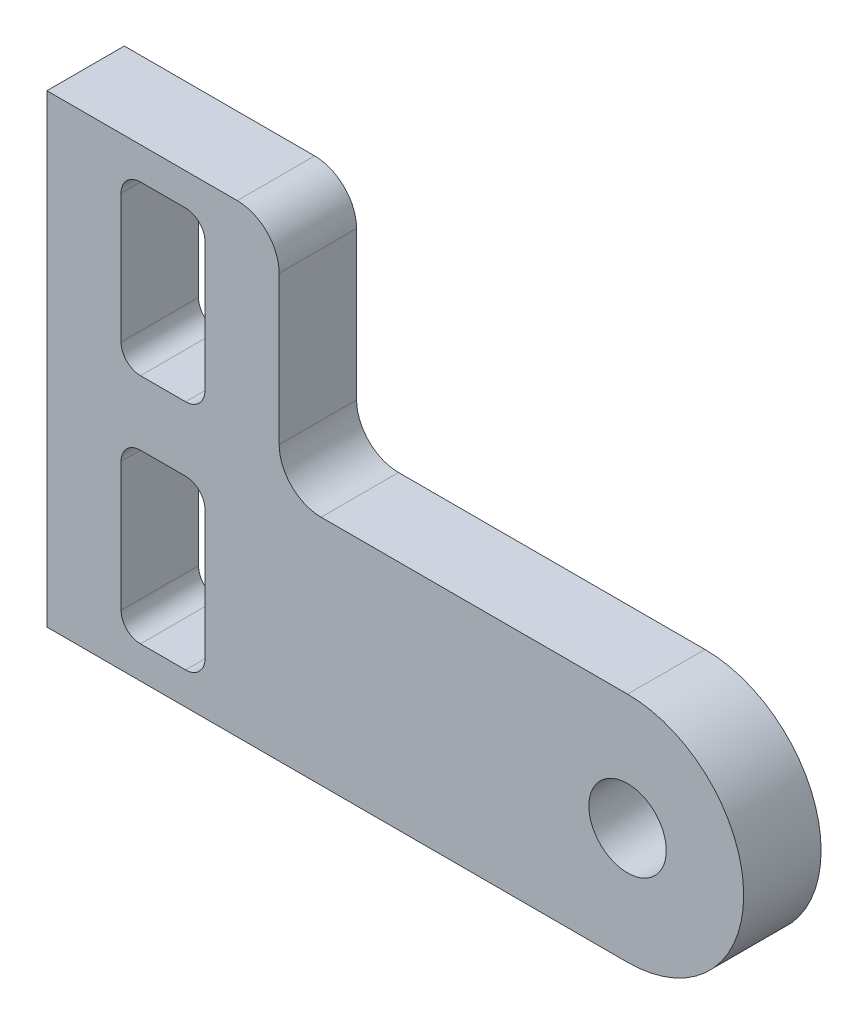
ISO-10303-21;
HEADER;
FILE_DESCRIPTION(('STEP AP214'),'2;1');
FILE_NAME('part.step','',(''),(''),'','','');
FILE_SCHEMA(('AUTOMOTIVE_DESIGN { 1 0 10303 214 1 1 1 1 }'));
ENDSEC;
DATA;
#1=APPLICATION_CONTEXT('core data for automotive mechanical design processes');
#2=APPLICATION_PROTOCOL_DEFINITION('international standard','automotive_design',2000,#1);
#3=PRODUCT_CONTEXT('',#1,'mechanical');
#4=PRODUCT('Part','Part','',(#3));
#5=PRODUCT_RELATED_PRODUCT_CATEGORY('part','',(#4));
#6=PRODUCT_DEFINITION_FORMATION('','',#4);
#7=PRODUCT_DEFINITION_CONTEXT('part definition',#1,'design');
#8=PRODUCT_DEFINITION('design','',#6,#7);
#9=PRODUCT_DEFINITION_SHAPE('','',#8);
#10=(LENGTH_UNIT() NAMED_UNIT(*) SI_UNIT(.MILLI.,.METRE.));
#11=(NAMED_UNIT(*) PLANE_ANGLE_UNIT() SI_UNIT($,.RADIAN.));
#12=(NAMED_UNIT(*) SI_UNIT($,.STERADIAN.) SOLID_ANGLE_UNIT());
#13=UNCERTAINTY_MEASURE_WITH_UNIT(LENGTH_MEASURE(1.E-05),#10,'distance_accuracy_value','');
#14=(GEOMETRIC_REPRESENTATION_CONTEXT(3) GLOBAL_UNCERTAINTY_ASSIGNED_CONTEXT((#13)) GLOBAL_UNIT_ASSIGNED_CONTEXT((#10,
#11,#12)) REPRESENTATION_CONTEXT('',''));
#15=CARTESIAN_POINT('',(0.,0.,0.));
#16=DIRECTION('',(0.,0.,1.));
#17=DIRECTION('',(1.,0.,0.));
#18=AXIS2_PLACEMENT_3D('',#15,#16,#17);
#19=CARTESIAN_POINT('',(201.0978533093,269.1465473352,3.));
#20=DIRECTION('',(0.,0.,1.));
#21=DIRECTION('',(1.,0.,0.));
#22=AXIS2_PLACEMENT_3D('',#19,#20,#21);
#23=PLANE('',#22);
#24=DIRECTION('',(1.,0.,0.));
#25=VECTOR('',#24,1.);
#26=CARTESIAN_POINT('',(182.2228533093,265.8965473352,3.));
#27=LINE('',#26,#25);
#28=CARTESIAN_POINT('',(182.2228533093,265.8965473352,3.));
#29=VERTEX_POINT('',#28);
#30=CARTESIAN_POINT('',(183.9728533093,265.8965473352,3.));
#31=VERTEX_POINT('',#30);
#32=EDGE_CURVE('E261',#29,#31,#27,.T.);
#33=ORIENTED_EDGE('',*,*,#32,.F.);
#34=CARTESIAN_POINT('',(182.2228533093,266.6465473352,3.));
#35=DIRECTION('',(0.,0.,1.));
#36=DIRECTION('',(1.,0.,0.));
#37=AXIS2_PLACEMENT_3D('',#34,#35,#36);
#38=CIRCLE('',#37,0.749999999999987);
#39=CARTESIAN_POINT('',(181.4728533093,266.6465473352,3.));
#40=VERTEX_POINT('',#39);
#41=EDGE_CURVE('E259',#40,#29,#38,.T.);
#42=ORIENTED_EDGE('',*,*,#41,.F.);
#43=DIRECTION('',(0.,-1.,0.));
#44=VECTOR('',#43,1.);
#45=CARTESIAN_POINT('',(181.4728533093,271.6465473352,3.));
#46=LINE('',#45,#44);
#47=CARTESIAN_POINT('',(181.4728533093,271.6465473352,3.));
#48=VERTEX_POINT('',#47);
#49=EDGE_CURVE('E275',#48,#40,#46,.T.);
#50=ORIENTED_EDGE('',*,*,#49,.F.);
#51=CARTESIAN_POINT('',(182.2228533093,271.6465473352,3.));
#52=DIRECTION('',(0.,0.,1.));
#53=DIRECTION('',(1.,0.,0.));
#54=AXIS2_PLACEMENT_3D('',#51,#52,#53);
#55=CIRCLE('',#54,0.750000000000015);
#56=CARTESIAN_POINT('',(182.2228533093,272.3965473352,3.));
#57=VERTEX_POINT('',#56);
#58=EDGE_CURVE('E272',#57,#48,#55,.T.);
#59=ORIENTED_EDGE('',*,*,#58,.F.);
#60=DIRECTION('',(-1.,0.,0.));
#61=VECTOR('',#60,1.);
#62=CARTESIAN_POINT('',(183.9728533093,272.3965473352,3.));
#63=LINE('',#62,#61);
#64=CARTESIAN_POINT('',(183.9728533093,272.3965473352,3.));
#65=VERTEX_POINT('',#64);
#66=EDGE_CURVE('E270',#65,#57,#63,.T.);
#67=ORIENTED_EDGE('',*,*,#66,.F.);
#68=CARTESIAN_POINT('',(183.9728533093,271.6465473352,3.));
#69=DIRECTION('',(0.,0.,1.));
#70=DIRECTION('',(1.,0.,0.));
#71=AXIS2_PLACEMENT_3D('',#68,#69,#70);
#72=CIRCLE('',#71,0.750000000000015);
#73=CARTESIAN_POINT('',(184.7228533093,271.6465473352,3.));
#74=VERTEX_POINT('',#73);
#75=EDGE_CURVE('E268',#74,#65,#72,.T.);
#76=ORIENTED_EDGE('',*,*,#75,.F.);
#77=DIRECTION('',(0.,1.,0.));
#78=VECTOR('',#77,1.);
#79=CARTESIAN_POINT('',(184.7228533093,266.6465473352,3.));
#80=LINE('',#79,#78);
#81=CARTESIAN_POINT('',(184.7228533093,266.6465473352,3.));
#82=VERTEX_POINT('',#81);
#83=EDGE_CURVE('E266',#82,#74,#80,.T.);
#84=ORIENTED_EDGE('',*,*,#83,.F.);
#85=CARTESIAN_POINT('',(183.9728533093,266.6465473352,3.));
#86=DIRECTION('',(0.,0.,1.));
#87=DIRECTION('',(1.,0.,0.));
#88=AXIS2_PLACEMENT_3D('',#85,#86,#87);
#89=CIRCLE('',#88,0.749999999999987);
#90=EDGE_CURVE('E264',#31,#82,#89,.T.);
#91=ORIENTED_EDGE('',*,*,#90,.F.);
#92=EDGE_LOOP('',(#33,#42,#50,#59,#67,#76,#84,#91));
#93=FACE_BOUND('',#92,.T.);
#94=CARTESIAN_POINT('',(201.0978533093,269.1465473352,3.));
#95=DIRECTION('',(0.,0.,1.));
#96=DIRECTION('',(1.,0.,0.));
#97=AXIS2_PLACEMENT_3D('',#94,#95,#96);
#98=CIRCLE('',#97,4.49999999999998);
#99=CARTESIAN_POINT('',(201.0978533093,264.6465473352,3.));
#100=VERTEX_POINT('',#99);
#101=CARTESIAN_POINT('',(201.0978533093,273.6465473352,3.));
#102=VERTEX_POINT('',#101);
#103=EDGE_CURVE('E324',#100,#102,#98,.T.);
#104=ORIENTED_EDGE('',*,*,#103,.T.);
#105=DIRECTION('',(-1.,0.,0.));
#106=VECTOR('',#105,1.);
#107=CARTESIAN_POINT('',(189.2228533093,273.6465473352,3.));
#108=LINE('',#107,#106);
#109=CARTESIAN_POINT('',(189.2228533093,273.6465473352,3.));
#110=VERTEX_POINT('',#109);
#111=EDGE_CURVE('E327',#102,#110,#108,.T.);
#112=ORIENTED_EDGE('',*,*,#111,.T.);
#113=CARTESIAN_POINT('',(189.2228533093,275.2715473352,3.));
#114=DIRECTION('',(0.,0.,-1.));
#115=DIRECTION('',(1.,0.,0.));
#116=AXIS2_PLACEMENT_3D('',#113,#114,#115);
#117=CIRCLE('',#116,1.62500000000002);
#118=CARTESIAN_POINT('',(187.5978533093,275.2715473352,3.));
#119=VERTEX_POINT('',#118);
#120=EDGE_CURVE('E330',#110,#119,#117,.T.);
#121=ORIENTED_EDGE('',*,*,#120,.T.);
#122=DIRECTION('',(0.,1.,0.));
#123=VECTOR('',#122,1.);
#124=CARTESIAN_POINT('',(187.5978533093,281.0215473352,3.));
#125=LINE('',#124,#123);
#126=CARTESIAN_POINT('',(187.5978533093,281.0215473352,3.));
#127=VERTEX_POINT('',#126);
#128=EDGE_CURVE('E332',#119,#127,#125,.T.);
#129=ORIENTED_EDGE('',*,*,#128,.T.);
#130=CARTESIAN_POINT('',(185.9728533093,281.0215473352,3.));
#131=DIRECTION('',(0.,0.,1.));
#132=DIRECTION('',(1.,0.,0.));
#133=AXIS2_PLACEMENT_3D('',#130,#131,#132);
#134=CIRCLE('',#133,1.62499999999999);
#135=CARTESIAN_POINT('',(185.9728533093,282.6465473352,3.));
#136=VERTEX_POINT('',#135);
#137=EDGE_CURVE('E334',#127,#136,#134,.T.);
#138=ORIENTED_EDGE('',*,*,#137,.T.);
#139=DIRECTION('',(-1.,0.,0.));
#140=VECTOR('',#139,1.);
#141=CARTESIAN_POINT('',(185.9728533093,282.6465473352,3.));
#142=LINE('',#141,#140);
#143=CARTESIAN_POINT('',(178.5978533093,282.6465473352,3.));
#144=VERTEX_POINT('',#143);
#145=EDGE_CURVE('E336',#136,#144,#142,.T.);
#146=ORIENTED_EDGE('',*,*,#145,.T.);
#147=DIRECTION('',(0.,-1.,0.));
#148=VECTOR('',#147,1.);
#149=CARTESIAN_POINT('',(178.5978533093,282.6465473352,3.));
#150=LINE('',#149,#148);
#151=CARTESIAN_POINT('',(178.5978533093,264.6465473352,3.));
#152=VERTEX_POINT('',#151);
#153=EDGE_CURVE('E338',#144,#152,#150,.T.);
#154=ORIENTED_EDGE('',*,*,#153,.T.);
#155=DIRECTION('',(1.,0.,0.));
#156=VECTOR('',#155,1.);
#157=CARTESIAN_POINT('',(201.0978533093,264.6465473352,3.));
#158=LINE('',#157,#156);
#159=EDGE_CURVE('E340',#152,#100,#158,.T.);
#160=ORIENTED_EDGE('',*,*,#159,.T.);
#161=EDGE_LOOP('',(#104,#112,#121,#129,#138,#146,#154,#160));
#162=FACE_BOUND('',#161,.T.);
#163=CARTESIAN_POINT('',(201.0978533093,269.1465473352,3.));
#164=DIRECTION('',(0.,0.,1.));
#165=DIRECTION('',(1.,0.,0.));
#166=AXIS2_PLACEMENT_3D('',#163,#164,#165);
#167=CIRCLE('',#166,1.5);
#168=CARTESIAN_POINT('',(202.5978533093,269.1465473352,3.));
#169=VERTEX_POINT('',#168);
#170=EDGE_CURVE('E318',#169,#169,#167,.T.);
#171=ORIENTED_EDGE('',*,*,#170,.F.);
#172=EDGE_LOOP('',(#171));
#173=FACE_BOUND('',#172,.T.);
#174=DIRECTION('',(1.,0.,0.));
#175=VECTOR('',#174,1.);
#176=CARTESIAN_POINT('',(182.2228533093,274.8959687639,3.));
#177=LINE('',#176,#175);
#178=CARTESIAN_POINT('',(182.2228533093,274.8959687639,3.));
#179=VERTEX_POINT('',#178);
#180=CARTESIAN_POINT('',(183.9728533093,274.8959687639,3.));
#181=VERTEX_POINT('',#180);
#182=EDGE_CURVE('E202',#179,#181,#177,.T.);
#183=ORIENTED_EDGE('',*,*,#182,.F.);
#184=CARTESIAN_POINT('',(182.2228533093,275.6459687639,3.));
#185=DIRECTION('',(0.,0.,1.));
#186=DIRECTION('',(1.,0.,0.));
#187=AXIS2_PLACEMENT_3D('',#184,#185,#186);
#188=CIRCLE('',#187,0.750000000000015);
#189=CARTESIAN_POINT('',(181.4728533093,275.6459687639,3.));
#190=VERTEX_POINT('',#189);
#191=EDGE_CURVE('E194',#190,#179,#188,.T.);
#192=ORIENTED_EDGE('',*,*,#191,.F.);
#193=DIRECTION('',(0.,-1.,0.));
#194=VECTOR('',#193,1.);
#195=CARTESIAN_POINT('',(181.4728533093,280.6459687639,3.));
#196=LINE('',#195,#194);
#197=CARTESIAN_POINT('',(181.4728533093,280.6459687639,3.));
#198=VERTEX_POINT('',#197);
#199=EDGE_CURVE('E227',#198,#190,#196,.T.);
#200=ORIENTED_EDGE('',*,*,#199,.F.);
#201=CARTESIAN_POINT('',(182.2228533093,280.6459687639,3.));
#202=DIRECTION('',(0.,0.,1.));
#203=DIRECTION('',(1.,0.,0.));
#204=AXIS2_PLACEMENT_3D('',#201,#202,#203);
#205=CIRCLE('',#204,0.750000000000015);
#206=CARTESIAN_POINT('',(182.2228533093,281.3959687639,3.));
#207=VERTEX_POINT('',#206);
#208=EDGE_CURVE('E225',#207,#198,#205,.T.);
#209=ORIENTED_EDGE('',*,*,#208,.F.);
#210=DIRECTION('',(-1.,0.,0.));
#211=VECTOR('',#210,1.);
#212=CARTESIAN_POINT('',(183.9728533093,281.3959687639,3.));
#213=LINE('',#212,#211);
#214=CARTESIAN_POINT('',(183.9728533093,281.3959687639,3.));
#215=VERTEX_POINT('',#214);
#216=EDGE_CURVE('E223',#215,#207,#213,.T.);
#217=ORIENTED_EDGE('',*,*,#216,.F.);
#218=CARTESIAN_POINT('',(183.9728533093,280.6459687639,3.));
#219=DIRECTION('',(0.,0.,1.));
#220=DIRECTION('',(1.,0.,0.));
#221=AXIS2_PLACEMENT_3D('',#218,#219,#220);
#222=CIRCLE('',#221,0.750000000000015);
#223=CARTESIAN_POINT('',(184.7228533093,280.6459687639,3.));
#224=VERTEX_POINT('',#223);
#225=EDGE_CURVE('E221',#224,#215,#222,.T.);
#226=ORIENTED_EDGE('',*,*,#225,.F.);
#227=DIRECTION('',(0.,1.,0.));
#228=VECTOR('',#227,1.);
#229=CARTESIAN_POINT('',(184.7228533093,275.6459687639,3.));
#230=LINE('',#229,#228);
#231=CARTESIAN_POINT('',(184.7228533093,275.6459687639,3.));
#232=VERTEX_POINT('',#231);
#233=EDGE_CURVE('E217',#232,#224,#230,.T.);
#234=ORIENTED_EDGE('',*,*,#233,.F.);
#235=CARTESIAN_POINT('',(183.9728533093,275.6459687639,3.));
#236=DIRECTION('',(0.,0.,1.));
#237=DIRECTION('',(1.,0.,0.));
#238=AXIS2_PLACEMENT_3D('',#235,#236,#237);
#239=CIRCLE('',#238,0.750000000000015);
#240=EDGE_CURVE('E215',#181,#232,#239,.T.);
#241=ORIENTED_EDGE('',*,*,#240,.F.);
#242=EDGE_LOOP('',(#183,#192,#200,#209,#217,#226,#234,#241));
#243=FACE_BOUND('',#242,.T.);
#244=ADVANCED_FACE('F33',(#93,#162,#173,#243),#23,.T.);
#245=CARTESIAN_POINT('',(201.0978533093,269.1465473352,0.));
#246=DIRECTION('',(0.,0.,1.));
#247=DIRECTION('',(1.,0.,0.));
#248=AXIS2_PLACEMENT_3D('',#245,#246,#247);
#249=PLANE('',#248);
#250=CARTESIAN_POINT('',(182.2228533093,266.6465473352,0.));
#251=DIRECTION('',(0.,0.,1.));
#252=DIRECTION('',(1.,0.,0.));
#253=AXIS2_PLACEMENT_3D('',#250,#251,#252);
#254=CIRCLE('',#253,0.749999999999987);
#255=CARTESIAN_POINT('',(181.4728533093,266.6465473352,0.));
#256=VERTEX_POINT('',#255);
#257=CARTESIAN_POINT('',(182.2228533093,265.8965473352,0.));
#258=VERTEX_POINT('',#257);
#259=EDGE_CURVE('E210',#256,#258,#254,.T.);
#260=ORIENTED_EDGE('',*,*,#259,.T.);
#261=DIRECTION('',(1.,0.,0.));
#262=VECTOR('',#261,1.);
#263=CARTESIAN_POINT('',(182.2228533093,265.8965473352,0.));
#264=LINE('',#263,#262);
#265=CARTESIAN_POINT('',(183.9728533093,265.8965473352,0.));
#266=VERTEX_POINT('',#265);
#267=EDGE_CURVE('E280',#258,#266,#264,.T.);
#268=ORIENTED_EDGE('',*,*,#267,.T.);
#269=CARTESIAN_POINT('',(183.9728533093,266.6465473352,0.));
#270=DIRECTION('',(0.,0.,1.));
#271=DIRECTION('',(1.,0.,0.));
#272=AXIS2_PLACEMENT_3D('',#269,#270,#271);
#273=CIRCLE('',#272,0.749999999999987);
#274=CARTESIAN_POINT('',(184.7228533093,266.6465473352,0.));
#275=VERTEX_POINT('',#274);
#276=EDGE_CURVE('E283',#266,#275,#273,.T.);
#277=ORIENTED_EDGE('',*,*,#276,.T.);
#278=DIRECTION('',(0.,1.,0.));
#279=VECTOR('',#278,1.);
#280=CARTESIAN_POINT('',(184.7228533093,266.6465473352,0.));
#281=LINE('',#280,#279);
#282=CARTESIAN_POINT('',(184.7228533093,271.6465473352,0.));
#283=VERTEX_POINT('',#282);
#284=EDGE_CURVE('E286',#275,#283,#281,.T.);
#285=ORIENTED_EDGE('',*,*,#284,.T.);
#286=CARTESIAN_POINT('',(183.9728533093,271.6465473352,0.));
#287=DIRECTION('',(0.,0.,1.));
#288=DIRECTION('',(1.,0.,0.));
#289=AXIS2_PLACEMENT_3D('',#286,#287,#288);
#290=CIRCLE('',#289,0.750000000000015);
#291=CARTESIAN_POINT('',(183.9728533093,272.3965473352,0.));
#292=VERTEX_POINT('',#291);
#293=EDGE_CURVE('E289',#283,#292,#290,.T.);
#294=ORIENTED_EDGE('',*,*,#293,.T.);
#295=DIRECTION('',(-1.,0.,0.));
#296=VECTOR('',#295,1.);
#297=CARTESIAN_POINT('',(183.9728533093,272.3965473352,0.));
#298=LINE('',#297,#296);
#299=CARTESIAN_POINT('',(182.2228533093,272.3965473352,0.));
#300=VERTEX_POINT('',#299);
#301=EDGE_CURVE('E292',#292,#300,#298,.T.);
#302=ORIENTED_EDGE('',*,*,#301,.T.);
#303=CARTESIAN_POINT('',(182.2228533093,271.6465473352,0.));
#304=DIRECTION('',(0.,0.,1.));
#305=DIRECTION('',(1.,0.,0.));
#306=AXIS2_PLACEMENT_3D('',#303,#304,#305);
#307=CIRCLE('',#306,0.750000000000015);
#308=CARTESIAN_POINT('',(181.4728533093,271.6465473352,0.));
#309=VERTEX_POINT('',#308);
#310=EDGE_CURVE('E295',#300,#309,#307,.T.);
#311=ORIENTED_EDGE('',*,*,#310,.T.);
#312=DIRECTION('',(0.,-1.,0.));
#313=VECTOR('',#312,1.);
#314=CARTESIAN_POINT('',(181.4728533093,271.6465473352,0.));
#315=LINE('',#314,#313);
#316=EDGE_CURVE('E262',#309,#256,#315,.T.);
#317=ORIENTED_EDGE('',*,*,#316,.T.);
#318=EDGE_LOOP('',(#260,#268,#277,#285,#294,#302,#311,#317));
#319=FACE_BOUND('',#318,.T.);
#320=CARTESIAN_POINT('',(201.0978533093,269.1465473352,0.));
#321=DIRECTION('',(0.,0.,1.));
#322=DIRECTION('',(1.,0.,0.));
#323=AXIS2_PLACEMENT_3D('',#320,#321,#322);
#324=CIRCLE('',#323,4.49999999999998);
#325=CARTESIAN_POINT('',(201.0978533093,264.6465473352,0.));
#326=VERTEX_POINT('',#325);
#327=CARTESIAN_POINT('',(201.0978533093,273.6465473352,0.));
#328=VERTEX_POINT('',#327);
#329=EDGE_CURVE('E321',#326,#328,#324,.T.);
#330=ORIENTED_EDGE('',*,*,#329,.F.);
#331=DIRECTION('',(1.,0.,0.));
#332=VECTOR('',#331,1.);
#333=CARTESIAN_POINT('',(201.0978533093,264.6465473352,0.));
#334=LINE('',#333,#332);
#335=CARTESIAN_POINT('',(178.5978533093,264.6465473352,0.));
#336=VERTEX_POINT('',#335);
#337=EDGE_CURVE('E328',#336,#326,#334,.T.);
#338=ORIENTED_EDGE('',*,*,#337,.F.);
#339=DIRECTION('',(0.,-1.,0.));
#340=VECTOR('',#339,1.);
#341=CARTESIAN_POINT('',(178.5978533093,282.6465473352,0.));
#342=LINE('',#341,#340);
#343=CARTESIAN_POINT('',(178.5978533093,282.6465473352,0.));
#344=VERTEX_POINT('',#343);
#345=EDGE_CURVE('E355',#344,#336,#342,.T.);
#346=ORIENTED_EDGE('',*,*,#345,.F.);
#347=DIRECTION('',(-1.,0.,0.));
#348=VECTOR('',#347,1.);
#349=CARTESIAN_POINT('',(185.9728533093,282.6465473352,0.));
#350=LINE('',#349,#348);
#351=CARTESIAN_POINT('',(185.9728533093,282.6465473352,0.));
#352=VERTEX_POINT('',#351);
#353=EDGE_CURVE('E353',#352,#344,#350,.T.);
#354=ORIENTED_EDGE('',*,*,#353,.F.);
#355=CARTESIAN_POINT('',(185.9728533093,281.0215473352,0.));
#356=DIRECTION('',(0.,0.,1.));
#357=DIRECTION('',(1.,0.,0.));
#358=AXIS2_PLACEMENT_3D('',#355,#356,#357);
#359=CIRCLE('',#358,1.62499999999999);
#360=CARTESIAN_POINT('',(187.5978533093,281.0215473352,0.));
#361=VERTEX_POINT('',#360);
#362=EDGE_CURVE('E351',#361,#352,#359,.T.);
#363=ORIENTED_EDGE('',*,*,#362,.F.);
#364=DIRECTION('',(0.,1.,0.));
#365=VECTOR('',#364,1.);
#366=CARTESIAN_POINT('',(187.5978533093,281.0215473352,0.));
#367=LINE('',#366,#365);
#368=CARTESIAN_POINT('',(187.5978533093,275.2715473352,0.));
#369=VERTEX_POINT('',#368);
#370=EDGE_CURVE('E349',#369,#361,#367,.T.);
#371=ORIENTED_EDGE('',*,*,#370,.F.);
#372=CARTESIAN_POINT('',(189.2228533093,275.2715473352,0.));
#373=DIRECTION('',(0.,0.,-1.));
#374=DIRECTION('',(1.,0.,0.));
#375=AXIS2_PLACEMENT_3D('',#372,#373,#374);
#376=CIRCLE('',#375,1.62500000000002);
#377=CARTESIAN_POINT('',(189.2228533093,273.6465473352,0.));
#378=VERTEX_POINT('',#377);
#379=EDGE_CURVE('E347',#378,#369,#376,.T.);
#380=ORIENTED_EDGE('',*,*,#379,.F.);
#381=DIRECTION('',(-1.,0.,0.));
#382=VECTOR('',#381,1.);
#383=CARTESIAN_POINT('',(189.2228533093,273.6465473352,0.));
#384=LINE('',#383,#382);
#385=EDGE_CURVE('E345',#328,#378,#384,.T.);
#386=ORIENTED_EDGE('',*,*,#385,.F.);
#387=EDGE_LOOP('',(#330,#338,#346,#354,#363,#371,#380,#386));
#388=FACE_BOUND('',#387,.T.);
#389=CARTESIAN_POINT('',(201.0978533093,269.1465473352,0.));
#390=DIRECTION('',(0.,0.,1.));
#391=DIRECTION('',(1.,0.,0.));
#392=AXIS2_PLACEMENT_3D('',#389,#390,#391);
#393=CIRCLE('',#392,1.5);
#394=CARTESIAN_POINT('',(202.5978533093,269.1465473352,0.));
#395=VERTEX_POINT('',#394);
#396=EDGE_CURVE('E317',#395,#395,#393,.T.);
#397=ORIENTED_EDGE('',*,*,#396,.T.);
#398=EDGE_LOOP('',(#397));
#399=FACE_BOUND('',#398,.T.);
#400=CARTESIAN_POINT('',(182.2228533093,275.6459687639,0.));
#401=DIRECTION('',(0.,0.,1.));
#402=DIRECTION('',(1.,0.,0.));
#403=AXIS2_PLACEMENT_3D('',#400,#401,#402);
#404=CIRCLE('',#403,0.750000000000015);
#405=CARTESIAN_POINT('',(181.4728533093,275.6459687639,0.));
#406=VERTEX_POINT('',#405);
#407=CARTESIAN_POINT('',(182.2228533093,274.8959687639,0.));
#408=VERTEX_POINT('',#407);
#409=EDGE_CURVE('E56',#406,#408,#404,.T.);
#410=ORIENTED_EDGE('',*,*,#409,.T.);
#411=DIRECTION('',(1.,0.,0.));
#412=VECTOR('',#411,1.);
#413=CARTESIAN_POINT('',(182.2228533093,274.8959687639,0.));
#414=LINE('',#413,#412);
#415=CARTESIAN_POINT('',(183.9728533093,274.8959687639,0.));
#416=VERTEX_POINT('',#415);
#417=EDGE_CURVE('E209',#408,#416,#414,.T.);
#418=ORIENTED_EDGE('',*,*,#417,.T.);
#419=CARTESIAN_POINT('',(183.9728533093,275.6459687639,0.));
#420=DIRECTION('',(0.,0.,1.));
#421=DIRECTION('',(1.,0.,0.));
#422=AXIS2_PLACEMENT_3D('',#419,#420,#421);
#423=CIRCLE('',#422,0.750000000000015);
#424=CARTESIAN_POINT('',(184.7228533093,275.6459687639,0.));
#425=VERTEX_POINT('',#424);
#426=EDGE_CURVE('E231',#416,#425,#423,.T.);
#427=ORIENTED_EDGE('',*,*,#426,.T.);
#428=DIRECTION('',(0.,1.,0.));
#429=VECTOR('',#428,1.);
#430=CARTESIAN_POINT('',(184.7228533093,275.6459687639,0.));
#431=LINE('',#430,#429);
#432=CARTESIAN_POINT('',(184.7228533093,280.6459687639,0.));
#433=VERTEX_POINT('',#432);
#434=EDGE_CURVE('E234',#425,#433,#431,.T.);
#435=ORIENTED_EDGE('',*,*,#434,.T.);
#436=CARTESIAN_POINT('',(183.9728533093,280.6459687639,0.));
#437=DIRECTION('',(0.,0.,1.));
#438=DIRECTION('',(1.,0.,0.));
#439=AXIS2_PLACEMENT_3D('',#436,#437,#438);
#440=CIRCLE('',#439,0.750000000000015);
#441=CARTESIAN_POINT('',(183.9728533093,281.3959687639,0.));
#442=VERTEX_POINT('',#441);
#443=EDGE_CURVE('E237',#433,#442,#440,.T.);
#444=ORIENTED_EDGE('',*,*,#443,.T.);
#445=DIRECTION('',(-1.,0.,0.));
#446=VECTOR('',#445,1.);
#447=CARTESIAN_POINT('',(183.9728533093,281.3959687639,0.));
#448=LINE('',#447,#446);
#449=CARTESIAN_POINT('',(182.2228533093,281.3959687639,0.));
#450=VERTEX_POINT('',#449);
#451=EDGE_CURVE('E240',#442,#450,#448,.T.);
#452=ORIENTED_EDGE('',*,*,#451,.T.);
#453=CARTESIAN_POINT('',(182.2228533093,280.6459687639,0.));
#454=DIRECTION('',(0.,0.,1.));
#455=DIRECTION('',(1.,0.,0.));
#456=AXIS2_PLACEMENT_3D('',#453,#454,#455);
#457=CIRCLE('',#456,0.750000000000015);
#458=CARTESIAN_POINT('',(181.4728533093,280.6459687639,0.));
#459=VERTEX_POINT('',#458);
#460=EDGE_CURVE('E243',#450,#459,#457,.T.);
#461=ORIENTED_EDGE('',*,*,#460,.T.);
#462=DIRECTION('',(0.,-1.,0.));
#463=VECTOR('',#462,1.);
#464=CARTESIAN_POINT('',(181.4728533093,280.6459687639,0.));
#465=LINE('',#464,#463);
#466=EDGE_CURVE('E203',#459,#406,#465,.T.);
#467=ORIENTED_EDGE('',*,*,#466,.T.);
#468=EDGE_LOOP('',(#410,#418,#427,#435,#444,#452,#461,#467));
#469=FACE_BOUND('',#468,.T.);
#470=ADVANCED_FACE('F385',(#319,#388,#399,#469),#249,.F.);
#471=CARTESIAN_POINT('',(201.0978533093,269.1465473352,3.));
#472=DIRECTION('',(0.,0.,-1.));
#473=DIRECTION('',(-1.,0.,0.));
#474=AXIS2_PLACEMENT_3D('',#471,#472,#473);
#475=CYLINDRICAL_SURFACE('',#474,4.49999999999998);
#476=ORIENTED_EDGE('',*,*,#329,.T.);
#477=DIRECTION('',(0.,0.,-1.));
#478=VECTOR('',#477,1.);
#479=CARTESIAN_POINT('',(201.0978533093,273.6465473352,3.));
#480=LINE('',#479,#478);
#481=EDGE_CURVE('E11',#102,#328,#480,.T.);
#482=ORIENTED_EDGE('',*,*,#481,.F.);
#483=ORIENTED_EDGE('',*,*,#103,.F.);
#484=DIRECTION('',(0.,0.,-1.));
#485=VECTOR('',#484,1.);
#486=CARTESIAN_POINT('',(201.0978533093,264.6465473352,3.));
#487=LINE('',#486,#485);
#488=EDGE_CURVE('E342',#100,#326,#487,.T.);
#489=ORIENTED_EDGE('',*,*,#488,.T.);
#490=EDGE_LOOP('',(#476,#482,#483,#489));
#491=FACE_BOUND('',#490,.T.);
#492=ADVANCED_FACE('F35',(#491),#475,.T.);
#493=CARTESIAN_POINT('',(189.2228533093,273.6465473352,3.));
#494=DIRECTION('',(0.,-1.,0.));
#495=DIRECTION('',(0.,0.,-1.));
#496=AXIS2_PLACEMENT_3D('',#493,#494,#495);
#497=PLANE('',#496);
#498=ORIENTED_EDGE('',*,*,#385,.T.);
#499=DIRECTION('',(0.,0.,-1.));
#500=VECTOR('',#499,1.);
#501=CARTESIAN_POINT('',(189.2228533093,273.6465473352,3.));
#502=LINE('',#501,#500);
#503=EDGE_CURVE('E41',#110,#378,#502,.T.);
#504=ORIENTED_EDGE('',*,*,#503,.F.);
#505=ORIENTED_EDGE('',*,*,#111,.F.);
#506=ORIENTED_EDGE('',*,*,#481,.T.);
#507=EDGE_LOOP('',(#498,#504,#505,#506));
#508=FACE_BOUND('',#507,.T.);
#509=ADVANCED_FACE('F403',(#508),#497,.F.);
#510=CARTESIAN_POINT('',(189.2228533093,275.2715473352,3.));
#511=DIRECTION('',(0.,0.,-1.));
#512=DIRECTION('',(-1.,0.,0.));
#513=AXIS2_PLACEMENT_3D('',#510,#511,#512);
#514=CYLINDRICAL_SURFACE('',#513,1.62500000000002);
#515=ORIENTED_EDGE('',*,*,#379,.T.);
#516=DIRECTION('',(0.,0.,-1.));
#517=VECTOR('',#516,1.);
#518=CARTESIAN_POINT('',(187.5978533093,275.2715473352,3.));
#519=LINE('',#518,#517);
#520=EDGE_CURVE('E372',#119,#369,#519,.T.);
#521=ORIENTED_EDGE('',*,*,#520,.F.);
#522=ORIENTED_EDGE('',*,*,#120,.F.);
#523=ORIENTED_EDGE('',*,*,#503,.T.);
#524=EDGE_LOOP('',(#515,#521,#522,#523));
#525=FACE_BOUND('',#524,.T.);
#526=ADVANCED_FACE('F379',(#525),#514,.F.);
#527=CARTESIAN_POINT('',(187.5978533093,281.0215473352,3.));
#528=DIRECTION('',(-1.,0.,0.));
#529=DIRECTION('',(0.,0.,1.));
#530=AXIS2_PLACEMENT_3D('',#527,#528,#529);
#531=PLANE('',#530);
#532=ORIENTED_EDGE('',*,*,#370,.T.);
#533=DIRECTION('',(0.,0.,-1.));
#534=VECTOR('',#533,1.);
#535=CARTESIAN_POINT('',(187.5978533093,281.0215473352,3.));
#536=LINE('',#535,#534);
#537=EDGE_CURVE('E369',#127,#361,#536,.T.);
#538=ORIENTED_EDGE('',*,*,#537,.F.);
#539=ORIENTED_EDGE('',*,*,#128,.F.);
#540=ORIENTED_EDGE('',*,*,#520,.T.);
#541=EDGE_LOOP('',(#532,#538,#539,#540));
#542=FACE_BOUND('',#541,.T.);
#543=ADVANCED_FACE('F391',(#542),#531,.F.);
#544=CARTESIAN_POINT('',(185.9728533093,281.0215473352,3.));
#545=DIRECTION('',(0.,0.,-1.));
#546=DIRECTION('',(-1.,0.,0.));
#547=AXIS2_PLACEMENT_3D('',#544,#545,#546);
#548=CYLINDRICAL_SURFACE('',#547,1.62499999999999);
#549=ORIENTED_EDGE('',*,*,#362,.T.);
#550=DIRECTION('',(0.,0.,-1.));
#551=VECTOR('',#550,1.);
#552=CARTESIAN_POINT('',(185.9728533093,282.6465473352,3.));
#553=LINE('',#552,#551);
#554=EDGE_CURVE('E366',#136,#352,#553,.T.);
#555=ORIENTED_EDGE('',*,*,#554,.F.);
#556=ORIENTED_EDGE('',*,*,#137,.F.);
#557=ORIENTED_EDGE('',*,*,#537,.T.);
#558=EDGE_LOOP('',(#549,#555,#556,#557));
#559=FACE_BOUND('',#558,.T.);
#560=ADVANCED_FACE('F395',(#559),#548,.T.);
#561=CARTESIAN_POINT('',(185.9728533093,282.6465473352,3.));
#562=DIRECTION('',(0.,-1.,0.));
#563=DIRECTION('',(0.,0.,-1.));
#564=AXIS2_PLACEMENT_3D('',#561,#562,#563);
#565=PLANE('',#564);
#566=ORIENTED_EDGE('',*,*,#353,.T.);
#567=DIRECTION('',(0.,0.,-1.));
#568=VECTOR('',#567,1.);
#569=CARTESIAN_POINT('',(178.5978533093,282.6465473352,3.));
#570=LINE('',#569,#568);
#571=EDGE_CURVE('E363',#144,#344,#570,.T.);
#572=ORIENTED_EDGE('',*,*,#571,.F.);
#573=ORIENTED_EDGE('',*,*,#145,.F.);
#574=ORIENTED_EDGE('',*,*,#554,.T.);
#575=EDGE_LOOP('',(#566,#572,#573,#574));
#576=FACE_BOUND('',#575,.T.);
#577=ADVANCED_FACE('F416',(#576),#565,.F.);
#578=CARTESIAN_POINT('',(178.5978533093,282.6465473352,3.));
#579=DIRECTION('',(1.,0.,0.));
#580=DIRECTION('',(0.,0.,-1.));
#581=AXIS2_PLACEMENT_3D('',#578,#579,#580);
#582=PLANE('',#581);
#583=ORIENTED_EDGE('',*,*,#345,.T.);
#584=DIRECTION('',(0.,0.,-1.));
#585=VECTOR('',#584,1.);
#586=CARTESIAN_POINT('',(178.5978533093,264.6465473352,3.));
#587=LINE('',#586,#585);
#588=EDGE_CURVE('E360',#152,#336,#587,.T.);
#589=ORIENTED_EDGE('',*,*,#588,.F.);
#590=ORIENTED_EDGE('',*,*,#153,.F.);
#591=ORIENTED_EDGE('',*,*,#571,.T.);
#592=EDGE_LOOP('',(#583,#589,#590,#591));
#593=FACE_BOUND('',#592,.T.);
#594=ADVANCED_FACE('F414',(#593),#582,.F.);
#595=CARTESIAN_POINT('',(201.0978533093,264.6465473352,3.));
#596=DIRECTION('',(0.,1.,0.));
#597=DIRECTION('',(0.,0.,1.));
#598=AXIS2_PLACEMENT_3D('',#595,#596,#597);
#599=PLANE('',#598);
#600=ORIENTED_EDGE('',*,*,#337,.T.);
#601=ORIENTED_EDGE('',*,*,#488,.F.);
#602=ORIENTED_EDGE('',*,*,#159,.F.);
#603=ORIENTED_EDGE('',*,*,#588,.T.);
#604=EDGE_LOOP('',(#600,#601,#602,#603));
#605=FACE_BOUND('',#604,.T.);
#606=ADVANCED_FACE('F409',(#605),#599,.F.);
#607=CARTESIAN_POINT('',(201.0978533093,269.1465473352,3.));
#608=DIRECTION('',(0.,0.,-1.));
#609=DIRECTION('',(-1.,0.,0.));
#610=AXIS2_PLACEMENT_3D('',#607,#608,#609);
#611=CYLINDRICAL_SURFACE('',#610,1.5);
#612=ORIENTED_EDGE('',*,*,#170,.T.);
#613=EDGE_LOOP('',(#612));
#614=FACE_BOUND('',#613,.T.);
#615=ORIENTED_EDGE('',*,*,#396,.F.);
#616=EDGE_LOOP('',(#615));
#617=FACE_BOUND('',#616,.T.);
#618=ADVANCED_FACE('F435',(#614,#617),#611,.F.);
#619=CARTESIAN_POINT('',(182.2228533093,266.6465473352,3.));
#620=DIRECTION('',(0.,0.,-1.));
#621=DIRECTION('',(-1.,0.,0.));
#622=AXIS2_PLACEMENT_3D('',#619,#620,#621);
#623=CYLINDRICAL_SURFACE('',#622,0.749999999999987);
#624=ORIENTED_EDGE('',*,*,#259,.F.);
#625=DIRECTION('',(0.,0.,-1.));
#626=VECTOR('',#625,1.);
#627=CARTESIAN_POINT('',(181.4728533093,266.6465473352,3.));
#628=LINE('',#627,#626);
#629=EDGE_CURVE('E277',#40,#256,#628,.T.);
#630=ORIENTED_EDGE('',*,*,#629,.F.);
#631=ORIENTED_EDGE('',*,*,#41,.T.);
#632=DIRECTION('',(0.,0.,-1.));
#633=VECTOR('',#632,1.);
#634=CARTESIAN_POINT('',(182.2228533093,265.8965473352,3.));
#635=LINE('',#634,#633);
#636=EDGE_CURVE('E314',#29,#258,#635,.T.);
#637=ORIENTED_EDGE('',*,*,#636,.T.);
#638=EDGE_LOOP('',(#624,#630,#631,#637));
#639=FACE_BOUND('',#638,.T.);
#640=ADVANCED_FACE('F442',(#639),#623,.F.);
#641=CARTESIAN_POINT('',(182.2228533093,265.8965473352,3.));
#642=DIRECTION('',(0.,1.,0.));
#643=DIRECTION('',(0.,0.,1.));
#644=AXIS2_PLACEMENT_3D('',#641,#642,#643);
#645=PLANE('',#644);
#646=ORIENTED_EDGE('',*,*,#267,.F.);
#647=ORIENTED_EDGE('',*,*,#636,.F.);
#648=ORIENTED_EDGE('',*,*,#32,.T.);
#649=DIRECTION('',(0.,0.,-1.));
#650=VECTOR('',#649,1.);
#651=CARTESIAN_POINT('',(183.9728533093,265.8965473352,3.));
#652=LINE('',#651,#650);
#653=EDGE_CURVE('E312',#31,#266,#652,.T.);
#654=ORIENTED_EDGE('',*,*,#653,.T.);
#655=EDGE_LOOP('',(#646,#647,#648,#654));
#656=FACE_BOUND('',#655,.T.);
#657=ADVANCED_FACE('F447',(#656),#645,.T.);
#658=CARTESIAN_POINT('',(183.9728533093,266.6465473352,3.));
#659=DIRECTION('',(0.,0.,-1.));
#660=DIRECTION('',(-1.,0.,0.));
#661=AXIS2_PLACEMENT_3D('',#658,#659,#660);
#662=CYLINDRICAL_SURFACE('',#661,0.749999999999987);
#663=ORIENTED_EDGE('',*,*,#276,.F.);
#664=ORIENTED_EDGE('',*,*,#653,.F.);
#665=ORIENTED_EDGE('',*,*,#90,.T.);
#666=DIRECTION('',(0.,0.,-1.));
#667=VECTOR('',#666,1.);
#668=CARTESIAN_POINT('',(184.7228533093,266.6465473352,3.));
#669=LINE('',#668,#667);
#670=EDGE_CURVE('E310',#82,#275,#669,.T.);
#671=ORIENTED_EDGE('',*,*,#670,.T.);
#672=EDGE_LOOP('',(#663,#664,#665,#671));
#673=FACE_BOUND('',#672,.T.);
#674=ADVANCED_FACE('F507',(#673),#662,.F.);
#675=CARTESIAN_POINT('',(184.7228533093,266.6465473352,3.));
#676=DIRECTION('',(-1.,0.,0.));
#677=DIRECTION('',(0.,0.,1.));
#678=AXIS2_PLACEMENT_3D('',#675,#676,#677);
#679=PLANE('',#678);
#680=ORIENTED_EDGE('',*,*,#284,.F.);
#681=ORIENTED_EDGE('',*,*,#670,.F.);
#682=ORIENTED_EDGE('',*,*,#83,.T.);
#683=DIRECTION('',(0.,0.,-1.));
#684=VECTOR('',#683,1.);
#685=CARTESIAN_POINT('',(184.7228533093,271.6465473352,3.));
#686=LINE('',#685,#684);
#687=EDGE_CURVE('E308',#74,#283,#686,.T.);
#688=ORIENTED_EDGE('',*,*,#687,.T.);
#689=EDGE_LOOP('',(#680,#681,#682,#688));
#690=FACE_BOUND('',#689,.T.);
#691=ADVANCED_FACE('F503',(#690),#679,.T.);
#692=CARTESIAN_POINT('',(183.9728533093,271.6465473352,3.));
#693=DIRECTION('',(0.,0.,-1.));
#694=DIRECTION('',(-1.,0.,0.));
#695=AXIS2_PLACEMENT_3D('',#692,#693,#694);
#696=CYLINDRICAL_SURFACE('',#695,0.750000000000015);
#697=ORIENTED_EDGE('',*,*,#293,.F.);
#698=ORIENTED_EDGE('',*,*,#687,.F.);
#699=ORIENTED_EDGE('',*,*,#75,.T.);
#700=DIRECTION('',(0.,0.,-1.));
#701=VECTOR('',#700,1.);
#702=CARTESIAN_POINT('',(183.9728533093,272.3965473352,3.));
#703=LINE('',#702,#701);
#704=EDGE_CURVE('E306',#65,#292,#703,.T.);
#705=ORIENTED_EDGE('',*,*,#704,.T.);
#706=EDGE_LOOP('',(#697,#698,#699,#705));
#707=FACE_BOUND('',#706,.T.);
#708=ADVANCED_FACE('F499',(#707),#696,.F.);
#709=CARTESIAN_POINT('',(183.9728533093,272.3965473352,3.));
#710=DIRECTION('',(0.,-1.,0.));
#711=DIRECTION('',(0.,0.,-1.));
#712=AXIS2_PLACEMENT_3D('',#709,#710,#711);
#713=PLANE('',#712);
#714=ORIENTED_EDGE('',*,*,#301,.F.);
#715=ORIENTED_EDGE('',*,*,#704,.F.);
#716=ORIENTED_EDGE('',*,*,#66,.T.);
#717=DIRECTION('',(0.,0.,-1.));
#718=VECTOR('',#717,1.);
#719=CARTESIAN_POINT('',(182.2228533093,272.3965473352,3.));
#720=LINE('',#719,#718);
#721=EDGE_CURVE('E304',#57,#300,#720,.T.);
#722=ORIENTED_EDGE('',*,*,#721,.T.);
#723=EDGE_LOOP('',(#714,#715,#716,#722));
#724=FACE_BOUND('',#723,.T.);
#725=ADVANCED_FACE('F495',(#724),#713,.T.);
#726=CARTESIAN_POINT('',(182.2228533093,271.6465473352,3.));
#727=DIRECTION('',(0.,0.,-1.));
#728=DIRECTION('',(-1.,0.,0.));
#729=AXIS2_PLACEMENT_3D('',#726,#727,#728);
#730=CYLINDRICAL_SURFACE('',#729,0.750000000000015);
#731=ORIENTED_EDGE('',*,*,#310,.F.);
#732=ORIENTED_EDGE('',*,*,#721,.F.);
#733=ORIENTED_EDGE('',*,*,#58,.T.);
#734=DIRECTION('',(0.,0.,-1.));
#735=VECTOR('',#734,1.);
#736=CARTESIAN_POINT('',(181.4728533093,271.6465473352,3.));
#737=LINE('',#736,#735);
#738=EDGE_CURVE('E302',#48,#309,#737,.T.);
#739=ORIENTED_EDGE('',*,*,#738,.T.);
#740=EDGE_LOOP('',(#731,#732,#733,#739));
#741=FACE_BOUND('',#740,.T.);
#742=ADVANCED_FACE('F491',(#741),#730,.F.);
#743=CARTESIAN_POINT('',(181.4728533093,271.6465473352,3.));
#744=DIRECTION('',(1.,0.,0.));
#745=DIRECTION('',(0.,0.,-1.));
#746=AXIS2_PLACEMENT_3D('',#743,#744,#745);
#747=PLANE('',#746);
#748=ORIENTED_EDGE('',*,*,#316,.F.);
#749=ORIENTED_EDGE('',*,*,#738,.F.);
#750=ORIENTED_EDGE('',*,*,#49,.T.);
#751=ORIENTED_EDGE('',*,*,#629,.T.);
#752=EDGE_LOOP('',(#748,#749,#750,#751));
#753=FACE_BOUND('',#752,.T.);
#754=ADVANCED_FACE('F488',(#753),#747,.T.);
#755=CARTESIAN_POINT('',(182.2228533093,275.6459687639,3.));
#756=DIRECTION('',(0.,0.,-1.));
#757=DIRECTION('',(-1.,0.,0.));
#758=AXIS2_PLACEMENT_3D('',#755,#756,#757);
#759=CYLINDRICAL_SURFACE('',#758,0.750000000000015);
#760=ORIENTED_EDGE('',*,*,#409,.F.);
#761=DIRECTION('',(0.,0.,-1.));
#762=VECTOR('',#761,1.);
#763=CARTESIAN_POINT('',(181.4728533093,275.6459687639,3.));
#764=LINE('',#763,#762);
#765=EDGE_CURVE('E198',#190,#406,#764,.T.);
#766=ORIENTED_EDGE('',*,*,#765,.F.);
#767=ORIENTED_EDGE('',*,*,#191,.T.);
#768=DIRECTION('',(0.,0.,-1.));
#769=VECTOR('',#768,1.);
#770=CARTESIAN_POINT('',(182.2228533093,274.8959687639,3.));
#771=LINE('',#770,#769);
#772=EDGE_CURVE('E197',#179,#408,#771,.T.);
#773=ORIENTED_EDGE('',*,*,#772,.T.);
#774=EDGE_LOOP('',(#760,#766,#767,#773));
#775=FACE_BOUND('',#774,.T.);
#776=ADVANCED_FACE('F196',(#775),#759,.F.);
#777=CARTESIAN_POINT('',(182.2228533093,274.8959687639,3.));
#778=DIRECTION('',(0.,1.,0.));
#779=DIRECTION('',(0.,0.,1.));
#780=AXIS2_PLACEMENT_3D('',#777,#778,#779);
#781=PLANE('',#780);
#782=ORIENTED_EDGE('',*,*,#417,.F.);
#783=ORIENTED_EDGE('',*,*,#772,.F.);
#784=ORIENTED_EDGE('',*,*,#182,.T.);
#785=DIRECTION('',(0.,0.,-1.));
#786=VECTOR('',#785,1.);
#787=CARTESIAN_POINT('',(183.9728533093,274.8959687639,3.));
#788=LINE('',#787,#786);
#789=EDGE_CURVE('E211',#181,#416,#788,.T.);
#790=ORIENTED_EDGE('',*,*,#789,.T.);
#791=EDGE_LOOP('',(#782,#783,#784,#790));
#792=FACE_BOUND('',#791,.T.);
#793=ADVANCED_FACE('F206',(#792),#781,.T.);
#794=CARTESIAN_POINT('',(183.9728533093,275.6459687639,3.));
#795=DIRECTION('',(0.,0.,-1.));
#796=DIRECTION('',(-1.,0.,0.));
#797=AXIS2_PLACEMENT_3D('',#794,#795,#796);
#798=CYLINDRICAL_SURFACE('',#797,0.750000000000015);
#799=ORIENTED_EDGE('',*,*,#426,.F.);
#800=ORIENTED_EDGE('',*,*,#789,.F.);
#801=ORIENTED_EDGE('',*,*,#240,.T.);
#802=DIRECTION('',(0.,0.,-1.));
#803=VECTOR('',#802,1.);
#804=CARTESIAN_POINT('',(184.7228533093,275.6459687639,3.));
#805=LINE('',#804,#803);
#806=EDGE_CURVE('E256',#232,#425,#805,.T.);
#807=ORIENTED_EDGE('',*,*,#806,.T.);
#808=EDGE_LOOP('',(#799,#800,#801,#807));
#809=FACE_BOUND('',#808,.T.);
#810=ADVANCED_FACE('F475',(#809),#798,.F.);
#811=CARTESIAN_POINT('',(184.7228533093,275.6459687639,3.));
#812=DIRECTION('',(-1.,0.,0.));
#813=DIRECTION('',(0.,0.,1.));
#814=AXIS2_PLACEMENT_3D('',#811,#812,#813);
#815=PLANE('',#814);
#816=ORIENTED_EDGE('',*,*,#434,.F.);
#817=ORIENTED_EDGE('',*,*,#806,.F.);
#818=ORIENTED_EDGE('',*,*,#233,.T.);
#819=DIRECTION('',(0.,0.,-1.));
#820=VECTOR('',#819,1.);
#821=CARTESIAN_POINT('',(184.7228533093,280.6459687639,3.));
#822=LINE('',#821,#820);
#823=EDGE_CURVE('E254',#224,#433,#822,.T.);
#824=ORIENTED_EDGE('',*,*,#823,.T.);
#825=EDGE_LOOP('',(#816,#817,#818,#824));
#826=FACE_BOUND('',#825,.T.);
#827=ADVANCED_FACE('F472',(#826),#815,.T.);
#828=CARTESIAN_POINT('',(183.9728533093,280.6459687639,3.));
#829=DIRECTION('',(0.,0.,-1.));
#830=DIRECTION('',(-1.,0.,0.));
#831=AXIS2_PLACEMENT_3D('',#828,#829,#830);
#832=CYLINDRICAL_SURFACE('',#831,0.750000000000015);
#833=ORIENTED_EDGE('',*,*,#443,.F.);
#834=ORIENTED_EDGE('',*,*,#823,.F.);
#835=ORIENTED_EDGE('',*,*,#225,.T.);
#836=DIRECTION('',(0.,0.,-1.));
#837=VECTOR('',#836,1.);
#838=CARTESIAN_POINT('',(183.9728533093,281.3959687639,3.));
#839=LINE('',#838,#837);
#840=EDGE_CURVE('E252',#215,#442,#839,.T.);
#841=ORIENTED_EDGE('',*,*,#840,.T.);
#842=EDGE_LOOP('',(#833,#834,#835,#841));
#843=FACE_BOUND('',#842,.T.);
#844=ADVANCED_FACE('F467',(#843),#832,.F.);
#845=CARTESIAN_POINT('',(183.9728533093,281.3959687639,3.));
#846=DIRECTION('',(0.,-1.,0.));
#847=DIRECTION('',(0.,0.,-1.));
#848=AXIS2_PLACEMENT_3D('',#845,#846,#847);
#849=PLANE('',#848);
#850=ORIENTED_EDGE('',*,*,#451,.F.);
#851=ORIENTED_EDGE('',*,*,#840,.F.);
#852=ORIENTED_EDGE('',*,*,#216,.T.);
#853=DIRECTION('',(0.,0.,-1.));
#854=VECTOR('',#853,1.);
#855=CARTESIAN_POINT('',(182.2228533093,281.3959687639,3.));
#856=LINE('',#855,#854);
#857=EDGE_CURVE('E250',#207,#450,#856,.T.);
#858=ORIENTED_EDGE('',*,*,#857,.T.);
#859=EDGE_LOOP('',(#850,#851,#852,#858));
#860=FACE_BOUND('',#859,.T.);
#861=ADVANCED_FACE('F463',(#860),#849,.T.);
#862=CARTESIAN_POINT('',(182.2228533093,280.6459687639,3.));
#863=DIRECTION('',(0.,0.,-1.));
#864=DIRECTION('',(-1.,0.,0.));
#865=AXIS2_PLACEMENT_3D('',#862,#863,#864);
#866=CYLINDRICAL_SURFACE('',#865,0.750000000000015);
#867=ORIENTED_EDGE('',*,*,#460,.F.);
#868=ORIENTED_EDGE('',*,*,#857,.F.);
#869=ORIENTED_EDGE('',*,*,#208,.T.);
#870=DIRECTION('',(0.,0.,-1.));
#871=VECTOR('',#870,1.);
#872=CARTESIAN_POINT('',(181.4728533093,280.6459687639,3.));
#873=LINE('',#872,#871);
#874=EDGE_CURVE('E48',#198,#459,#873,.T.);
#875=ORIENTED_EDGE('',*,*,#874,.T.);
#876=EDGE_LOOP('',(#867,#868,#869,#875));
#877=FACE_BOUND('',#876,.T.);
#878=ADVANCED_FACE('F460',(#877),#866,.F.);
#879=CARTESIAN_POINT('',(181.4728533093,280.6459687639,3.));
#880=DIRECTION('',(1.,0.,0.));
#881=DIRECTION('',(0.,0.,-1.));
#882=AXIS2_PLACEMENT_3D('',#879,#880,#881);
#883=PLANE('',#882);
#884=ORIENTED_EDGE('',*,*,#466,.F.);
#885=ORIENTED_EDGE('',*,*,#874,.F.);
#886=ORIENTED_EDGE('',*,*,#199,.T.);
#887=ORIENTED_EDGE('',*,*,#765,.T.);
#888=EDGE_LOOP('',(#884,#885,#886,#887));
#889=FACE_BOUND('',#888,.T.);
#890=ADVANCED_FACE('F454',(#889),#883,.T.);
#891=CLOSED_SHELL('',(#244,#470,#492,#509,#526,#543,#560,#577,#594,#606,#618,#640,#657,#674,
#691,#708,#725,#742,#754,#776,#793,#810,#827,#844,#861,#878,#890));
#892=MANIFOLD_SOLID_BREP('B2',#891);
#893=ADVANCED_BREP_SHAPE_REPRESENTATION('',(#18,#892),#14);
#894=SHAPE_DEFINITION_REPRESENTATION(#9,#893);
ENDSEC;
END-ISO-10303-21;
